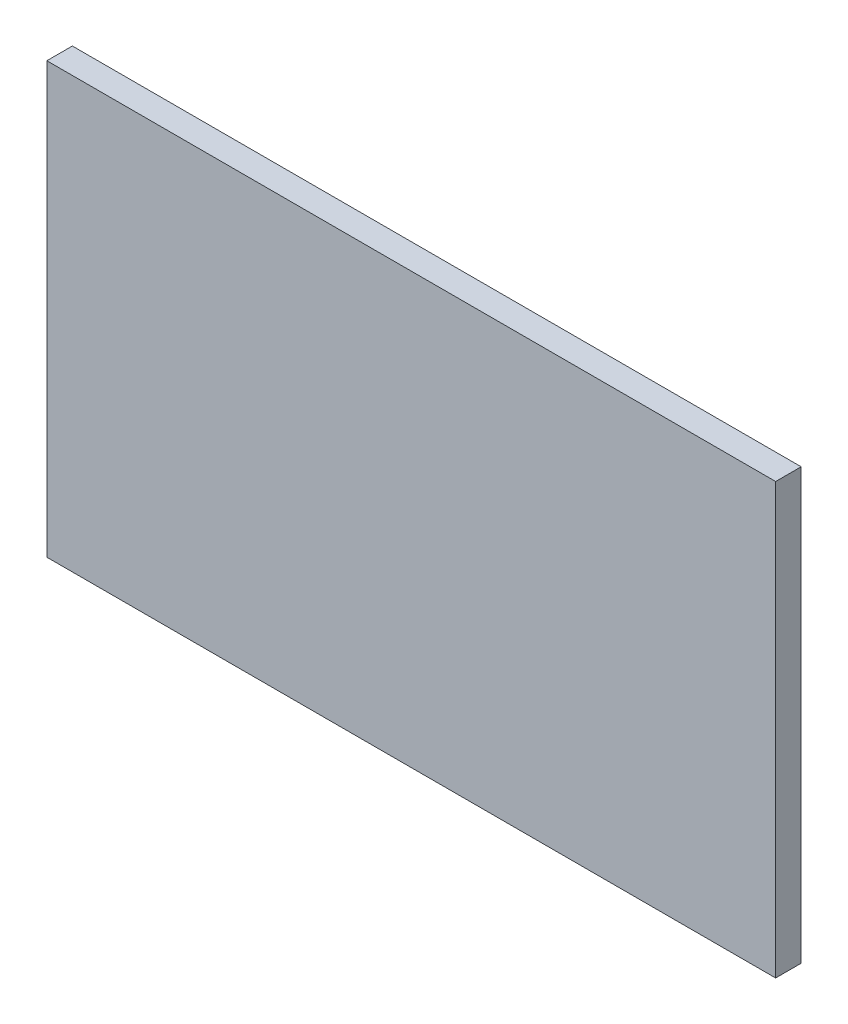
ISO-10303-21;
HEADER;
FILE_DESCRIPTION(('STEP AP214'),'2;1');
FILE_NAME('part.step','',(''),(''),'','','');
FILE_SCHEMA(('AUTOMOTIVE_DESIGN { 1 0 10303 214 1 1 1 1 }'));
ENDSEC;
DATA;
#1=APPLICATION_CONTEXT('core data for automotive mechanical design processes');
#2=APPLICATION_PROTOCOL_DEFINITION('international standard','automotive_design',2000,#1);
#3=PRODUCT_CONTEXT('',#1,'mechanical');
#4=PRODUCT('Part','Part','',(#3));
#5=PRODUCT_RELATED_PRODUCT_CATEGORY('part','',(#4));
#6=PRODUCT_DEFINITION_FORMATION('','',#4);
#7=PRODUCT_DEFINITION_CONTEXT('part definition',#1,'design');
#8=PRODUCT_DEFINITION('design','',#6,#7);
#9=PRODUCT_DEFINITION_SHAPE('','',#8);
#10=(LENGTH_UNIT() NAMED_UNIT(*) SI_UNIT(.MILLI.,.METRE.));
#11=(NAMED_UNIT(*) PLANE_ANGLE_UNIT() SI_UNIT($,.RADIAN.));
#12=(NAMED_UNIT(*) SI_UNIT($,.STERADIAN.) SOLID_ANGLE_UNIT());
#13=UNCERTAINTY_MEASURE_WITH_UNIT(LENGTH_MEASURE(1.E-05),#10,'distance_accuracy_value','');
#14=(GEOMETRIC_REPRESENTATION_CONTEXT(3) GLOBAL_UNCERTAINTY_ASSIGNED_CONTEXT((#13)) GLOBAL_UNIT_ASSIGNED_CONTEXT((#10,
#11,#12)) REPRESENTATION_CONTEXT('',''));
#15=CARTESIAN_POINT('',(0.,0.,0.));
#16=DIRECTION('',(0.,0.,1.));
#17=DIRECTION('',(1.,0.,0.));
#18=AXIS2_PLACEMENT_3D('',#15,#16,#17);
#19=CARTESIAN_POINT('',(254.,149.86,17.78));
#20=DIRECTION('',(-1.,0.,0.));
#21=DIRECTION('',(0.,0.,1.));
#22=AXIS2_PLACEMENT_3D('',#19,#20,#21);
#23=PLANE('',#22);
#24=DIRECTION('',(0.,1.,0.));
#25=VECTOR('',#24,1.);
#26=CARTESIAN_POINT('',(254.,149.86,0.));
#27=LINE('',#26,#25);
#28=CARTESIAN_POINT('',(254.,-149.86,0.));
#29=VERTEX_POINT('',#28);
#30=CARTESIAN_POINT('',(254.,149.86,0.));
#31=VERTEX_POINT('',#30);
#32=EDGE_CURVE('E98',#29,#31,#27,.T.);
#33=ORIENTED_EDGE('',*,*,#32,.T.);
#34=DIRECTION('',(0.,0.,-1.));
#35=VECTOR('',#34,1.);
#36=CARTESIAN_POINT('',(254.,149.86,17.78));
#37=LINE('',#36,#35);
#38=CARTESIAN_POINT('',(254.,149.86,17.78));
#39=VERTEX_POINT('',#38);
#40=EDGE_CURVE('E11',#39,#31,#37,.T.);
#41=ORIENTED_EDGE('',*,*,#40,.F.);
#42=DIRECTION('',(0.,1.,0.));
#43=VECTOR('',#42,1.);
#44=CARTESIAN_POINT('',(254.,149.86,17.78));
#45=LINE('',#44,#43);
#46=CARTESIAN_POINT('',(254.,-149.86,17.78));
#47=VERTEX_POINT('',#46);
#48=EDGE_CURVE('E86',#47,#39,#45,.T.);
#49=ORIENTED_EDGE('',*,*,#48,.F.);
#50=DIRECTION('',(0.,0.,-1.));
#51=VECTOR('',#50,1.);
#52=CARTESIAN_POINT('',(254.,-149.86,17.78));
#53=LINE('',#52,#51);
#54=EDGE_CURVE('E94',#47,#29,#53,.T.);
#55=ORIENTED_EDGE('',*,*,#54,.T.);
#56=EDGE_LOOP('',(#33,#41,#49,#55));
#57=FACE_BOUND('',#56,.T.);
#58=ADVANCED_FACE('F35',(#57),#23,.F.);
#59=CARTESIAN_POINT('',(-254.,149.86,17.78));
#60=DIRECTION('',(0.,-1.,0.));
#61=DIRECTION('',(0.,0.,-1.));
#62=AXIS2_PLACEMENT_3D('',#59,#60,#61);
#63=PLANE('',#62);
#64=DIRECTION('',(-1.,0.,0.));
#65=VECTOR('',#64,1.);
#66=CARTESIAN_POINT('',(-254.,149.86,0.));
#67=LINE('',#66,#65);
#68=CARTESIAN_POINT('',(-254.,149.86,0.));
#69=VERTEX_POINT('',#68);
#70=EDGE_CURVE('E90',#31,#69,#67,.T.);
#71=ORIENTED_EDGE('',*,*,#70,.T.);
#72=DIRECTION('',(0.,0.,-1.));
#73=VECTOR('',#72,1.);
#74=CARTESIAN_POINT('',(-254.,149.86,17.78));
#75=LINE('',#74,#73);
#76=CARTESIAN_POINT('',(-254.,149.86,17.78));
#77=VERTEX_POINT('',#76);
#78=EDGE_CURVE('E43',#77,#69,#75,.T.);
#79=ORIENTED_EDGE('',*,*,#78,.F.);
#80=DIRECTION('',(-1.,0.,0.));
#81=VECTOR('',#80,1.);
#82=CARTESIAN_POINT('',(-254.,149.86,17.78));
#83=LINE('',#82,#81);
#84=EDGE_CURVE('E81',#39,#77,#83,.T.);
#85=ORIENTED_EDGE('',*,*,#84,.F.);
#86=ORIENTED_EDGE('',*,*,#40,.T.);
#87=EDGE_LOOP('',(#71,#79,#85,#86));
#88=FACE_BOUND('',#87,.T.);
#89=ADVANCED_FACE('F89',(#88),#63,.F.);
#90=CARTESIAN_POINT('',(-254.,149.86,17.78));
#91=DIRECTION('',(1.,0.,0.));
#92=DIRECTION('',(0.,0.,-1.));
#93=AXIS2_PLACEMENT_3D('',#90,#91,#92);
#94=PLANE('',#93);
#95=DIRECTION('',(0.,-1.,0.));
#96=VECTOR('',#95,1.);
#97=CARTESIAN_POINT('',(-254.,149.86,0.));
#98=LINE('',#97,#96);
#99=CARTESIAN_POINT('',(-254.,-149.86,0.));
#100=VERTEX_POINT('',#99);
#101=EDGE_CURVE('E68',#69,#100,#98,.T.);
#102=ORIENTED_EDGE('',*,*,#101,.T.);
#103=DIRECTION('',(0.,0.,-1.));
#104=VECTOR('',#103,1.);
#105=CARTESIAN_POINT('',(-254.,-149.86,17.78));
#106=LINE('',#105,#104);
#107=CARTESIAN_POINT('',(-254.,-149.86,17.78));
#108=VERTEX_POINT('',#107);
#109=EDGE_CURVE('E91',#108,#100,#106,.T.);
#110=ORIENTED_EDGE('',*,*,#109,.F.);
#111=DIRECTION('',(0.,-1.,0.));
#112=VECTOR('',#111,1.);
#113=CARTESIAN_POINT('',(-254.,149.86,17.78));
#114=LINE('',#113,#112);
#115=EDGE_CURVE('E84',#77,#108,#114,.T.);
#116=ORIENTED_EDGE('',*,*,#115,.F.);
#117=ORIENTED_EDGE('',*,*,#78,.T.);
#118=EDGE_LOOP('',(#102,#110,#116,#117));
#119=FACE_BOUND('',#118,.T.);
#120=ADVANCED_FACE('F92',(#119),#94,.F.);
#121=CARTESIAN_POINT('',(-254.,-149.86,17.78));
#122=DIRECTION('',(0.,1.,0.));
#123=DIRECTION('',(0.,0.,1.));
#124=AXIS2_PLACEMENT_3D('',#121,#122,#123);
#125=PLANE('',#124);
#126=DIRECTION('',(1.,0.,0.));
#127=VECTOR('',#126,1.);
#128=CARTESIAN_POINT('',(-254.,-149.86,0.));
#129=LINE('',#128,#127);
#130=EDGE_CURVE('E74',#100,#29,#129,.T.);
#131=ORIENTED_EDGE('',*,*,#130,.T.);
#132=ORIENTED_EDGE('',*,*,#54,.F.);
#133=DIRECTION('',(1.,0.,0.));
#134=VECTOR('',#133,1.);
#135=CARTESIAN_POINT('',(-254.,-149.86,17.78));
#136=LINE('',#135,#134);
#137=EDGE_CURVE('E51',#108,#47,#136,.T.);
#138=ORIENTED_EDGE('',*,*,#137,.F.);
#139=ORIENTED_EDGE('',*,*,#109,.T.);
#140=EDGE_LOOP('',(#131,#132,#138,#139));
#141=FACE_BOUND('',#140,.T.);
#142=ADVANCED_FACE('F105',(#141),#125,.F.);
#143=CARTESIAN_POINT('',(0.,0.,17.78));
#144=DIRECTION('',(0.,0.,1.));
#145=DIRECTION('',(1.,0.,0.));
#146=AXIS2_PLACEMENT_3D('',#143,#144,#145);
#147=PLANE('',#146);
#148=ORIENTED_EDGE('',*,*,#48,.T.);
#149=ORIENTED_EDGE('',*,*,#84,.T.);
#150=ORIENTED_EDGE('',*,*,#115,.T.);
#151=ORIENTED_EDGE('',*,*,#137,.T.);
#152=EDGE_LOOP('',(#148,#149,#150,#151));
#153=FACE_BOUND('',#152,.T.);
#154=ADVANCED_FACE('F82',(#153),#147,.T.);
#155=CARTESIAN_POINT('',(0.,0.,0.));
#156=DIRECTION('',(0.,0.,1.));
#157=DIRECTION('',(1.,0.,0.));
#158=AXIS2_PLACEMENT_3D('',#155,#156,#157);
#159=PLANE('',#158);
#160=ORIENTED_EDGE('',*,*,#32,.F.);
#161=ORIENTED_EDGE('',*,*,#130,.F.);
#162=ORIENTED_EDGE('',*,*,#101,.F.);
#163=ORIENTED_EDGE('',*,*,#70,.F.);
#164=EDGE_LOOP('',(#160,#161,#162,#163));
#165=FACE_BOUND('',#164,.T.);
#166=ADVANCED_FACE('F108',(#165),#159,.F.);
#167=CLOSED_SHELL('',(#58,#89,#120,#142,#154,#166));
#168=MANIFOLD_SOLID_BREP('B2',#167);
#169=ADVANCED_BREP_SHAPE_REPRESENTATION('',(#18,#168),#14);
#170=SHAPE_DEFINITION_REPRESENTATION(#9,#169);
ENDSEC;
END-ISO-10303-21;
